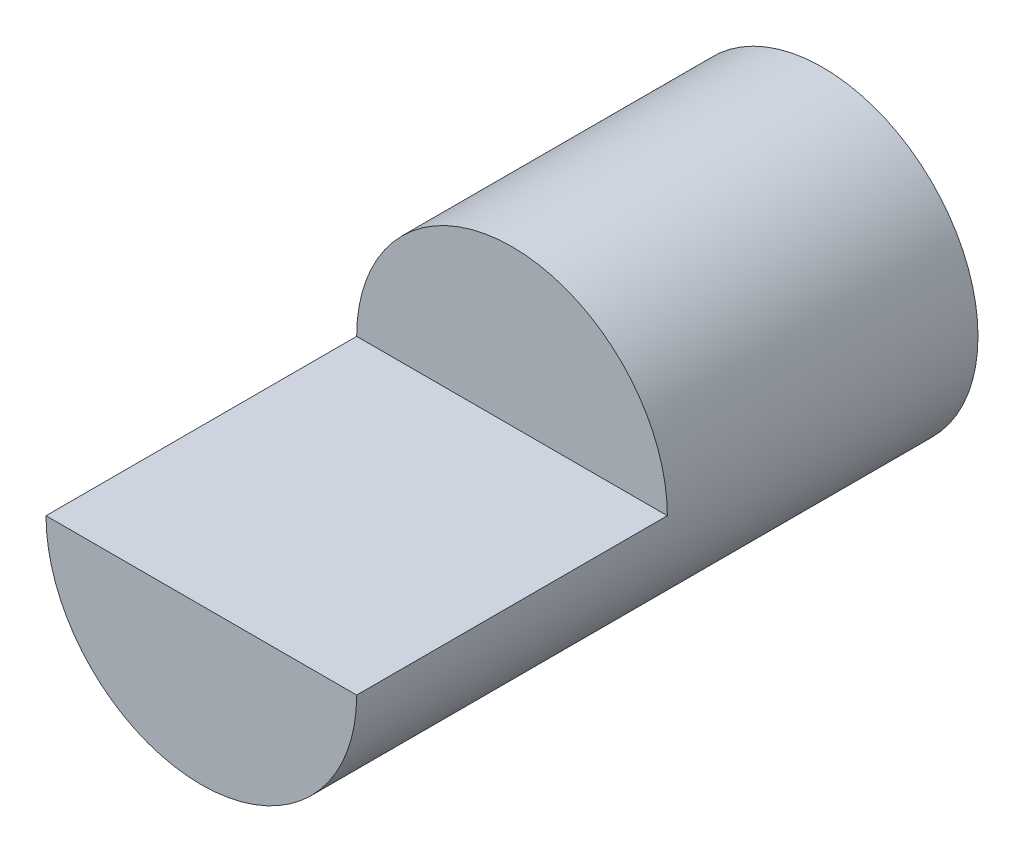
ISO-10303-21;
HEADER;
FILE_DESCRIPTION(('STEP AP214'),'2;1');
FILE_NAME('part.step','',(''),(''),'','','');
FILE_SCHEMA(('AUTOMOTIVE_DESIGN { 1 0 10303 214 1 1 1 1 }'));
ENDSEC;
DATA;
#1=APPLICATION_CONTEXT('core data for automotive mechanical design processes');
#2=APPLICATION_PROTOCOL_DEFINITION('international standard','automotive_design',2000,#1);
#3=PRODUCT_CONTEXT('',#1,'mechanical');
#4=PRODUCT('Part','Part','',(#3));
#5=PRODUCT_RELATED_PRODUCT_CATEGORY('part','',(#4));
#6=PRODUCT_DEFINITION_FORMATION('','',#4);
#7=PRODUCT_DEFINITION_CONTEXT('part definition',#1,'design');
#8=PRODUCT_DEFINITION('design','',#6,#7);
#9=PRODUCT_DEFINITION_SHAPE('','',#8);
#10=(LENGTH_UNIT() NAMED_UNIT(*) SI_UNIT(.MILLI.,.METRE.));
#11=(NAMED_UNIT(*) PLANE_ANGLE_UNIT() SI_UNIT($,.RADIAN.));
#12=(NAMED_UNIT(*) SI_UNIT($,.STERADIAN.) SOLID_ANGLE_UNIT());
#13=UNCERTAINTY_MEASURE_WITH_UNIT(LENGTH_MEASURE(1.E-05),#10,'distance_accuracy_value','');
#14=(GEOMETRIC_REPRESENTATION_CONTEXT(3) GLOBAL_UNCERTAINTY_ASSIGNED_CONTEXT((#13)) GLOBAL_UNIT_ASSIGNED_CONTEXT((#10,
#11,#12)) REPRESENTATION_CONTEXT('',''));
#15=CARTESIAN_POINT('',(0.,0.,0.));
#16=DIRECTION('',(0.,0.,1.));
#17=DIRECTION('',(1.,0.,0.));
#18=AXIS2_PLACEMENT_3D('',#15,#16,#17);
#19=CARTESIAN_POINT('',(0.,0.,12.7));
#20=DIRECTION('',(0.,0.,-1.));
#21=DIRECTION('',(-1.,0.,0.));
#22=AXIS2_PLACEMENT_3D('',#19,#20,#21);
#23=CYLINDRICAL_SURFACE('',#22,6.35);
#24=CARTESIAN_POINT('',(0.,0.,12.7));
#25=DIRECTION('',(0.,0.,1.));
#26=DIRECTION('',(1.,0.,0.));
#27=AXIS2_PLACEMENT_3D('',#24,#25,#26);
#28=CIRCLE('',#27,6.35);
#29=CARTESIAN_POINT('',(6.35,0.,12.7));
#30=VERTEX_POINT('',#29);
#31=CARTESIAN_POINT('',(-6.35,0.,12.7));
#32=VERTEX_POINT('',#31);
#33=EDGE_CURVE('E11',#30,#32,#28,.T.);
#34=ORIENTED_EDGE('',*,*,#33,.F.);
#35=DIRECTION('',(0.,0.,-1.));
#36=VECTOR('',#35,1.);
#37=CARTESIAN_POINT('',(6.35,0.,25.4));
#38=LINE('',#37,#36);
#39=CARTESIAN_POINT('',(6.35,0.,25.4));
#40=VERTEX_POINT('',#39);
#41=EDGE_CURVE('E77',#40,#30,#38,.T.);
#42=ORIENTED_EDGE('',*,*,#41,.F.);
#43=CARTESIAN_POINT('',(0.,0.,25.4));
#44=DIRECTION('',(0.,0.,1.));
#45=DIRECTION('',(1.,0.,0.));
#46=AXIS2_PLACEMENT_3D('',#43,#44,#45);
#47=CIRCLE('',#46,6.35);
#48=CARTESIAN_POINT('',(-6.35,0.,25.4));
#49=VERTEX_POINT('',#48);
#50=EDGE_CURVE('E79',#49,#40,#47,.T.);
#51=ORIENTED_EDGE('',*,*,#50,.F.);
#52=DIRECTION('',(0.,0.,-1.));
#53=VECTOR('',#52,1.);
#54=CARTESIAN_POINT('',(-6.35,0.,25.4));
#55=LINE('',#54,#53);
#56=EDGE_CURVE('E75',#49,#32,#55,.T.);
#57=ORIENTED_EDGE('',*,*,#56,.T.);
#58=EDGE_LOOP('',(#34,#42,#51,#57));
#59=FACE_BOUND('',#58,.T.);
#60=CARTESIAN_POINT('',(0.,0.,0.));
#61=DIRECTION('',(0.,0.,1.));
#62=DIRECTION('',(1.,0.,0.));
#63=AXIS2_PLACEMENT_3D('',#60,#61,#62);
#64=CIRCLE('',#63,6.35);
#65=CARTESIAN_POINT('',(6.35,0.,0.));
#66=VERTEX_POINT('',#65);
#67=EDGE_CURVE('E46',#66,#66,#64,.T.);
#68=ORIENTED_EDGE('',*,*,#67,.T.);
#69=EDGE_LOOP('',(#68));
#70=FACE_BOUND('',#69,.T.);
#71=ADVANCED_FACE('F43',(#59,#70),#23,.T.);
#72=CARTESIAN_POINT('',(0.,0.,12.7));
#73=DIRECTION('',(0.,0.,1.));
#74=DIRECTION('',(1.,0.,0.));
#75=AXIS2_PLACEMENT_3D('',#72,#73,#74);
#76=PLANE('',#75);
#77=DIRECTION('',(-1.,0.,0.));
#78=VECTOR('',#77,1.);
#79=CARTESIAN_POINT('',(6.35,0.,12.7));
#80=LINE('',#79,#78);
#81=EDGE_CURVE('E56',#30,#32,#80,.T.);
#82=ORIENTED_EDGE('',*,*,#81,.F.);
#83=ORIENTED_EDGE('',*,*,#33,.T.);
#84=EDGE_LOOP('',(#82,#83));
#85=FACE_BOUND('',#84,.T.);
#86=ADVANCED_FACE('F68',(#85),#76,.T.);
#87=CARTESIAN_POINT('',(0.,0.,0.));
#88=DIRECTION('',(0.,0.,1.));
#89=DIRECTION('',(1.,0.,0.));
#90=AXIS2_PLACEMENT_3D('',#87,#88,#89);
#91=PLANE('',#90);
#92=ORIENTED_EDGE('',*,*,#67,.F.);
#93=EDGE_LOOP('',(#92));
#94=FACE_BOUND('',#93,.T.);
#95=ADVANCED_FACE('F96',(#94),#91,.F.);
#96=CARTESIAN_POINT('',(6.35,0.,25.4));
#97=DIRECTION('',(0.,-1.,0.));
#98=DIRECTION('',(0.,0.,-1.));
#99=AXIS2_PLACEMENT_3D('',#96,#97,#98);
#100=PLANE('',#99);
#101=ORIENTED_EDGE('',*,*,#81,.T.);
#102=ORIENTED_EDGE('',*,*,#56,.F.);
#103=DIRECTION('',(-1.,0.,0.));
#104=VECTOR('',#103,1.);
#105=CARTESIAN_POINT('',(6.35,0.,25.4));
#106=LINE('',#105,#104);
#107=EDGE_CURVE('E64',#40,#49,#106,.T.);
#108=ORIENTED_EDGE('',*,*,#107,.F.);
#109=ORIENTED_EDGE('',*,*,#41,.T.);
#110=EDGE_LOOP('',(#101,#102,#108,#109));
#111=FACE_BOUND('',#110,.T.);
#112=ADVANCED_FACE('F74',(#111),#100,.F.);
#113=CARTESIAN_POINT('',(0.,0.,25.4));
#114=DIRECTION('',(0.,0.,1.));
#115=DIRECTION('',(1.,0.,0.));
#116=AXIS2_PLACEMENT_3D('',#113,#114,#115);
#117=PLANE('',#116);
#118=ORIENTED_EDGE('',*,*,#50,.T.);
#119=ORIENTED_EDGE('',*,*,#107,.T.);
#120=EDGE_LOOP('',(#118,#119));
#121=FACE_BOUND('',#120,.T.);
#122=ADVANCED_FACE('F90',(#121),#117,.T.);
#123=CLOSED_SHELL('',(#71,#86,#95,#112,#122));
#124=MANIFOLD_SOLID_BREP('B2',#123);
#125=ADVANCED_BREP_SHAPE_REPRESENTATION('',(#18,#124),#14);
#126=SHAPE_DEFINITION_REPRESENTATION(#9,#125);
ENDSEC;
END-ISO-10303-21;
